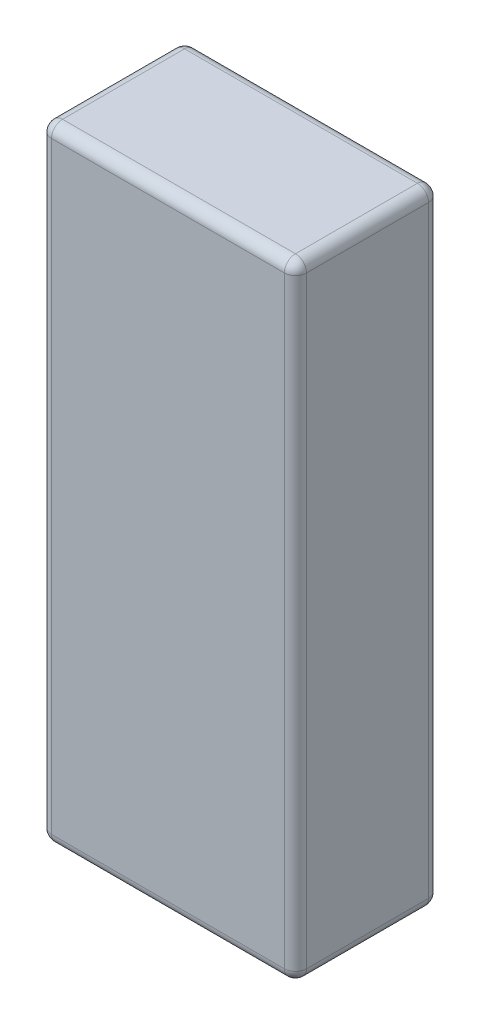
ISO-10303-21;
HEADER;
FILE_DESCRIPTION(('STEP AP214'),'2;1');
FILE_NAME('part.step','',(''),(''),'','','');
FILE_SCHEMA(('AUTOMOTIVE_DESIGN { 1 0 10303 214 1 1 1 1 }'));
ENDSEC;
DATA;
#1=APPLICATION_CONTEXT('core data for automotive mechanical design processes');
#2=APPLICATION_PROTOCOL_DEFINITION('international standard','automotive_design',2000,#1);
#3=PRODUCT_CONTEXT('',#1,'mechanical');
#4=PRODUCT('Part','Part','',(#3));
#5=PRODUCT_RELATED_PRODUCT_CATEGORY('part','',(#4));
#6=PRODUCT_DEFINITION_FORMATION('','',#4);
#7=PRODUCT_DEFINITION_CONTEXT('part definition',#1,'design');
#8=PRODUCT_DEFINITION('design','',#6,#7);
#9=PRODUCT_DEFINITION_SHAPE('','',#8);
#10=(LENGTH_UNIT() NAMED_UNIT(*) SI_UNIT(.MILLI.,.METRE.));
#11=(NAMED_UNIT(*) PLANE_ANGLE_UNIT() SI_UNIT($,.RADIAN.));
#12=(NAMED_UNIT(*) SI_UNIT($,.STERADIAN.) SOLID_ANGLE_UNIT());
#13=UNCERTAINTY_MEASURE_WITH_UNIT(LENGTH_MEASURE(1.E-05),#10,'distance_accuracy_value','');
#14=(GEOMETRIC_REPRESENTATION_CONTEXT(3) GLOBAL_UNCERTAINTY_ASSIGNED_CONTEXT((#13)) GLOBAL_UNIT_ASSIGNED_CONTEXT((#10,
#11,#12)) REPRESENTATION_CONTEXT('',''));
#15=CARTESIAN_POINT('',(0.,0.,0.));
#16=DIRECTION('',(0.,0.,1.));
#17=DIRECTION('',(1.,0.,0.));
#18=AXIS2_PLACEMENT_3D('',#15,#16,#17);
#19=CARTESIAN_POINT('',(34.5,-84.5,19.5));
#20=DIRECTION('',(-1.,0.,0.));
#21=DIRECTION('',(0.,0.,1.));
#22=AXIS2_PLACEMENT_3D('',#19,#20,#21);
#23=PLANE('',#22);
#24=DIRECTION('',(0.,1.,0.));
#25=VECTOR('',#24,1.);
#26=CARTESIAN_POINT('',(34.5,-84.5,16.5));
#27=LINE('',#26,#25);
#28=CARTESIAN_POINT('',(34.5,81.5,16.5));
#29=VERTEX_POINT('',#28);
#30=CARTESIAN_POINT('',(34.5,-81.5,16.5));
#31=VERTEX_POINT('',#30);
#32=EDGE_CURVE('E140',#29,#31,#27,.F.);
#33=ORIENTED_EDGE('',*,*,#32,.T.);
#34=DIRECTION('',(0.,0.,-1.));
#35=VECTOR('',#34,1.);
#36=CARTESIAN_POINT('',(34.5,-81.5,19.5));
#37=LINE('',#36,#35);
#38=CARTESIAN_POINT('',(34.5,-81.5,-16.5));
#39=VERTEX_POINT('',#38);
#40=EDGE_CURVE('E187',#31,#39,#37,.T.);
#41=ORIENTED_EDGE('',*,*,#40,.T.);
#42=DIRECTION('',(0.,1.,0.));
#43=VECTOR('',#42,1.);
#44=CARTESIAN_POINT('',(34.5,84.5,-16.5));
#45=LINE('',#44,#43);
#46=CARTESIAN_POINT('',(34.5,81.5,-16.5));
#47=VERTEX_POINT('',#46);
#48=EDGE_CURVE('E184',#39,#47,#45,.T.);
#49=ORIENTED_EDGE('',*,*,#48,.T.);
#50=DIRECTION('',(0.,0.,-1.));
#51=VECTOR('',#50,1.);
#52=CARTESIAN_POINT('',(34.5,81.5,19.5));
#53=LINE('',#52,#51);
#54=EDGE_CURVE('E182',#47,#29,#53,.F.);
#55=ORIENTED_EDGE('',*,*,#54,.T.);
#56=EDGE_LOOP('',(#33,#41,#49,#55));
#57=FACE_BOUND('',#56,.T.);
#58=ADVANCED_FACE('F33',(#57),#23,.F.);
#59=CARTESIAN_POINT('',(-34.5,84.5,19.5));
#60=DIRECTION('',(0.,-1.,0.));
#61=DIRECTION('',(0.,0.,-1.));
#62=AXIS2_PLACEMENT_3D('',#59,#60,#61);
#63=PLANE('',#62);
#64=DIRECTION('',(-1.,0.,0.));
#65=VECTOR('',#64,1.);
#66=CARTESIAN_POINT('',(-34.5,84.5,16.5));
#67=LINE('',#66,#65);
#68=CARTESIAN_POINT('',(-31.5,84.5,16.5));
#69=VERTEX_POINT('',#68);
#70=CARTESIAN_POINT('',(31.5,84.5,16.5));
#71=VERTEX_POINT('',#70);
#72=EDGE_CURVE('E42',#69,#71,#67,.F.);
#73=ORIENTED_EDGE('',*,*,#72,.T.);
#74=DIRECTION('',(0.,0.,-1.));
#75=VECTOR('',#74,1.);
#76=CARTESIAN_POINT('',(31.5,84.5,19.5));
#77=LINE('',#76,#75);
#78=CARTESIAN_POINT('',(31.5,84.5,-16.5));
#79=VERTEX_POINT('',#78);
#80=EDGE_CURVE('E11',#71,#79,#77,.T.);
#81=ORIENTED_EDGE('',*,*,#80,.T.);
#82=DIRECTION('',(-1.,0.,0.));
#83=VECTOR('',#82,1.);
#84=CARTESIAN_POINT('',(-34.5,84.5,-16.5));
#85=LINE('',#84,#83);
#86=CARTESIAN_POINT('',(-31.5,84.5,-16.5));
#87=VERTEX_POINT('',#86);
#88=EDGE_CURVE('E198',#79,#87,#85,.T.);
#89=ORIENTED_EDGE('',*,*,#88,.T.);
#90=DIRECTION('',(0.,0.,-1.));
#91=VECTOR('',#90,1.);
#92=CARTESIAN_POINT('',(-31.5,84.5,19.5));
#93=LINE('',#92,#91);
#94=EDGE_CURVE('E53',#87,#69,#93,.F.);
#95=ORIENTED_EDGE('',*,*,#94,.T.);
#96=EDGE_LOOP('',(#73,#81,#89,#95));
#97=FACE_BOUND('',#96,.T.);
#98=ADVANCED_FACE('F297',(#97),#63,.F.);
#99=CARTESIAN_POINT('',(-34.5,-84.5,19.5));
#100=DIRECTION('',(1.,0.,0.));
#101=DIRECTION('',(0.,0.,-1.));
#102=AXIS2_PLACEMENT_3D('',#99,#100,#101);
#103=PLANE('',#102);
#104=DIRECTION('',(0.,-1.,0.));
#105=VECTOR('',#104,1.);
#106=CARTESIAN_POINT('',(-34.5,-84.5,-16.5));
#107=LINE('',#106,#105);
#108=CARTESIAN_POINT('',(-34.5,81.5,-16.5));
#109=VERTEX_POINT('',#108);
#110=CARTESIAN_POINT('',(-34.5,-81.5,-16.5));
#111=VERTEX_POINT('',#110);
#112=EDGE_CURVE('E166',#109,#111,#107,.T.);
#113=ORIENTED_EDGE('',*,*,#112,.T.);
#114=DIRECTION('',(0.,0.,-1.));
#115=VECTOR('',#114,1.);
#116=CARTESIAN_POINT('',(-34.5,-81.5,19.5));
#117=LINE('',#116,#115);
#118=CARTESIAN_POINT('',(-34.5,-81.5,16.5));
#119=VERTEX_POINT('',#118);
#120=EDGE_CURVE('E171',#111,#119,#117,.F.);
#121=ORIENTED_EDGE('',*,*,#120,.T.);
#122=DIRECTION('',(0.,-1.,0.));
#123=VECTOR('',#122,1.);
#124=CARTESIAN_POINT('',(-34.5,-84.5,16.5));
#125=LINE('',#124,#123);
#126=CARTESIAN_POINT('',(-34.5,81.5,16.5));
#127=VERTEX_POINT('',#126);
#128=EDGE_CURVE('E168',#119,#127,#125,.F.);
#129=ORIENTED_EDGE('',*,*,#128,.T.);
#130=DIRECTION('',(0.,0.,-1.));
#131=VECTOR('',#130,1.);
#132=CARTESIAN_POINT('',(-34.5,81.5,19.5));
#133=LINE('',#132,#131);
#134=EDGE_CURVE('E164',#127,#109,#133,.T.);
#135=ORIENTED_EDGE('',*,*,#134,.T.);
#136=EDGE_LOOP('',(#113,#121,#129,#135));
#137=FACE_BOUND('',#136,.T.);
#138=ADVANCED_FACE('F302',(#137),#103,.F.);
#139=CARTESIAN_POINT('',(-34.5,-84.5,19.5));
#140=DIRECTION('',(0.,1.,0.));
#141=DIRECTION('',(0.,0.,1.));
#142=AXIS2_PLACEMENT_3D('',#139,#140,#141);
#143=PLANE('',#142);
#144=DIRECTION('',(1.,0.,0.));
#145=VECTOR('',#144,1.);
#146=CARTESIAN_POINT('',(-34.5,-84.5,16.5));
#147=LINE('',#146,#145);
#148=CARTESIAN_POINT('',(31.5,-84.5,16.5));
#149=VERTEX_POINT('',#148);
#150=CARTESIAN_POINT('',(-31.5,-84.5,16.5));
#151=VERTEX_POINT('',#150);
#152=EDGE_CURVE('E193',#149,#151,#147,.F.);
#153=ORIENTED_EDGE('',*,*,#152,.T.);
#154=DIRECTION('',(0.,0.,-1.));
#155=VECTOR('',#154,1.);
#156=CARTESIAN_POINT('',(-31.5,-84.5,19.5));
#157=LINE('',#156,#155);
#158=CARTESIAN_POINT('',(-31.5,-84.5,-16.5));
#159=VERTEX_POINT('',#158);
#160=EDGE_CURVE('E195',#151,#159,#157,.T.);
#161=ORIENTED_EDGE('',*,*,#160,.T.);
#162=DIRECTION('',(1.,0.,0.));
#163=VECTOR('',#162,1.);
#164=CARTESIAN_POINT('',(34.5,-84.5,-16.5));
#165=LINE('',#164,#163);
#166=CARTESIAN_POINT('',(31.5,-84.5,-16.5));
#167=VERTEX_POINT('',#166);
#168=EDGE_CURVE('E189',#159,#167,#165,.T.);
#169=ORIENTED_EDGE('',*,*,#168,.T.);
#170=DIRECTION('',(0.,0.,-1.));
#171=VECTOR('',#170,1.);
#172=CARTESIAN_POINT('',(31.5,-84.5,19.5));
#173=LINE('',#172,#171);
#174=EDGE_CURVE('E191',#167,#149,#173,.F.);
#175=ORIENTED_EDGE('',*,*,#174,.T.);
#176=EDGE_LOOP('',(#153,#161,#169,#175));
#177=FACE_BOUND('',#176,.T.);
#178=ADVANCED_FACE('F265',(#177),#143,.F.);
#179=CARTESIAN_POINT('',(0.,0.,19.5));
#180=DIRECTION('',(0.,0.,-1.));
#181=DIRECTION('',(-1.,0.,0.));
#182=AXIS2_PLACEMENT_3D('',#179,#180,#181);
#183=PLANE('',#182);
#184=DIRECTION('',(0.,-1.,0.));
#185=VECTOR('',#184,1.);
#186=CARTESIAN_POINT('',(-31.5,0.,19.5));
#187=LINE('',#186,#185);
#188=CARTESIAN_POINT('',(-31.5,81.5,19.5));
#189=VERTEX_POINT('',#188);
#190=CARTESIAN_POINT('',(-31.5,-81.5,19.5));
#191=VERTEX_POINT('',#190);
#192=EDGE_CURVE('E132',#189,#191,#187,.T.);
#193=ORIENTED_EDGE('',*,*,#192,.T.);
#194=DIRECTION('',(1.,0.,0.));
#195=VECTOR('',#194,1.);
#196=CARTESIAN_POINT('',(0.,-81.5,19.5));
#197=LINE('',#196,#195);
#198=CARTESIAN_POINT('',(31.5,-81.5,19.5));
#199=VERTEX_POINT('',#198);
#200=EDGE_CURVE('E128',#191,#199,#197,.T.);
#201=ORIENTED_EDGE('',*,*,#200,.T.);
#202=DIRECTION('',(0.,1.,0.));
#203=VECTOR('',#202,1.);
#204=CARTESIAN_POINT('',(31.5,0.,19.5));
#205=LINE('',#204,#203);
#206=CARTESIAN_POINT('',(31.5,81.5,19.5));
#207=VERTEX_POINT('',#206);
#208=EDGE_CURVE('E120',#199,#207,#205,.T.);
#209=ORIENTED_EDGE('',*,*,#208,.T.);
#210=DIRECTION('',(-1.,0.,0.));
#211=VECTOR('',#210,1.);
#212=CARTESIAN_POINT('',(0.,81.5,19.5));
#213=LINE('',#212,#211);
#214=EDGE_CURVE('E125',#207,#189,#213,.T.);
#215=ORIENTED_EDGE('',*,*,#214,.T.);
#216=EDGE_LOOP('',(#193,#201,#209,#215));
#217=FACE_BOUND('',#216,.T.);
#218=ADVANCED_FACE('F123',(#217),#183,.F.);
#219=CARTESIAN_POINT('',(0.,0.,-19.5));
#220=DIRECTION('',(0.,0.,-1.));
#221=DIRECTION('',(-1.,0.,0.));
#222=AXIS2_PLACEMENT_3D('',#219,#220,#221);
#223=PLANE('',#222);
#224=DIRECTION('',(0.,1.,0.));
#225=VECTOR('',#224,1.);
#226=CARTESIAN_POINT('',(31.5,-84.5,-19.5));
#227=LINE('',#226,#225);
#228=CARTESIAN_POINT('',(31.5,81.5,-19.5));
#229=VERTEX_POINT('',#228);
#230=CARTESIAN_POINT('',(31.5,-81.5,-19.5));
#231=VERTEX_POINT('',#230);
#232=EDGE_CURVE('E175',#229,#231,#227,.F.);
#233=ORIENTED_EDGE('',*,*,#232,.T.);
#234=DIRECTION('',(1.,0.,0.));
#235=VECTOR('',#234,1.);
#236=CARTESIAN_POINT('',(-34.5,-81.5,-19.5));
#237=LINE('',#236,#235);
#238=CARTESIAN_POINT('',(-31.5,-81.5,-19.5));
#239=VERTEX_POINT('',#238);
#240=EDGE_CURVE('E180',#231,#239,#237,.F.);
#241=ORIENTED_EDGE('',*,*,#240,.T.);
#242=DIRECTION('',(0.,-1.,0.));
#243=VECTOR('',#242,1.);
#244=CARTESIAN_POINT('',(-31.5,84.5,-19.5));
#245=LINE('',#244,#243);
#246=CARTESIAN_POINT('',(-31.5,81.5,-19.5));
#247=VERTEX_POINT('',#246);
#248=EDGE_CURVE('E177',#239,#247,#245,.F.);
#249=ORIENTED_EDGE('',*,*,#248,.T.);
#250=DIRECTION('',(-1.,0.,0.));
#251=VECTOR('',#250,1.);
#252=CARTESIAN_POINT('',(34.5,81.5,-19.5));
#253=LINE('',#252,#251);
#254=EDGE_CURVE('E173',#247,#229,#253,.F.);
#255=ORIENTED_EDGE('',*,*,#254,.T.);
#256=EDGE_LOOP('',(#233,#241,#249,#255));
#257=FACE_BOUND('',#256,.T.);
#258=ADVANCED_FACE('F274',(#257),#223,.T.);
#259=CARTESIAN_POINT('',(31.5,-84.5,-16.5));
#260=DIRECTION('',(0.,-1.,0.));
#261=DIRECTION('',(0.,0.,-1.));
#262=AXIS2_PLACEMENT_3D('',#259,#260,#261);
#263=CYLINDRICAL_SURFACE('',#262,3.);
#264=CARTESIAN_POINT('',(31.5,81.5,-16.5));
#265=DIRECTION('',(0.,1.,0.));
#266=DIRECTION('',(0.,0.,1.));
#267=AXIS2_PLACEMENT_3D('',#264,#265,#266);
#268=CIRCLE('',#267,3.);
#269=EDGE_CURVE('E37',#47,#229,#268,.T.);
#270=ORIENTED_EDGE('',*,*,#269,.F.);
#271=ORIENTED_EDGE('',*,*,#48,.F.);
#272=CARTESIAN_POINT('',(31.5,-81.5,-16.5));
#273=DIRECTION('',(0.,-1.,0.));
#274=DIRECTION('',(0.,0.,-1.));
#275=AXIS2_PLACEMENT_3D('',#272,#273,#274);
#276=CIRCLE('',#275,3.);
#277=EDGE_CURVE('E160',#231,#39,#276,.T.);
#278=ORIENTED_EDGE('',*,*,#277,.F.);
#279=ORIENTED_EDGE('',*,*,#232,.F.);
#280=EDGE_LOOP('',(#270,#271,#278,#279));
#281=FACE_BOUND('',#280,.T.);
#282=ADVANCED_FACE('F35',(#281),#263,.T.);
#283=CARTESIAN_POINT('',(31.5,81.5,-16.5));
#284=DIRECTION('',(0.,0.,1.));
#285=DIRECTION('',(1.,0.,0.));
#286=AXIS2_PLACEMENT_3D('',#283,#284,#285);
#287=SPHERICAL_SURFACE('',#286,3.);
#288=CARTESIAN_POINT('',(31.5,81.5,-16.5));
#289=DIRECTION('',(0.,0.,-1.));
#290=DIRECTION('',(-1.,0.,0.));
#291=AXIS2_PLACEMENT_3D('',#288,#289,#290);
#292=CIRCLE('',#291,3.);
#293=EDGE_CURVE('E243',#47,#79,#292,.F.);
#294=ORIENTED_EDGE('',*,*,#293,.F.);
#295=ORIENTED_EDGE('',*,*,#269,.T.);
#296=CARTESIAN_POINT('',(31.5,81.5,-16.5));
#297=DIRECTION('',(1.,0.,0.));
#298=DIRECTION('',(0.,0.,-1.));
#299=AXIS2_PLACEMENT_3D('',#296,#297,#298);
#300=CIRCLE('',#299,3.);
#301=EDGE_CURVE('E246',#79,#229,#300,.F.);
#302=ORIENTED_EDGE('',*,*,#301,.F.);
#303=EDGE_LOOP('',(#294,#295,#302));
#304=FACE_BOUND('',#303,.T.);
#305=ADVANCED_FACE('F291',(#304),#287,.T.);
#306=CARTESIAN_POINT('',(31.5,-81.5,-16.5));
#307=DIRECTION('',(0.,0.,1.));
#308=DIRECTION('',(1.,0.,0.));
#309=AXIS2_PLACEMENT_3D('',#306,#307,#308);
#310=SPHERICAL_SURFACE('',#309,3.);
#311=CARTESIAN_POINT('',(31.5,-81.5,-16.5));
#312=DIRECTION('',(1.,0.,0.));
#313=DIRECTION('',(0.,0.,-1.));
#314=AXIS2_PLACEMENT_3D('',#311,#312,#313);
#315=CIRCLE('',#314,3.);
#316=EDGE_CURVE('E237',#231,#167,#315,.F.);
#317=ORIENTED_EDGE('',*,*,#316,.F.);
#318=ORIENTED_EDGE('',*,*,#277,.T.);
#319=CARTESIAN_POINT('',(31.5,-81.5,-16.5));
#320=DIRECTION('',(0.,0.,-1.));
#321=DIRECTION('',(-1.,0.,0.));
#322=AXIS2_PLACEMENT_3D('',#319,#320,#321);
#323=CIRCLE('',#322,3.);
#324=EDGE_CURVE('E240',#167,#39,#323,.F.);
#325=ORIENTED_EDGE('',*,*,#324,.F.);
#326=EDGE_LOOP('',(#317,#318,#325));
#327=FACE_BOUND('',#326,.T.);
#328=ADVANCED_FACE('F253',(#327),#310,.T.);
#329=CARTESIAN_POINT('',(-34.5,81.5,-16.5));
#330=DIRECTION('',(1.,0.,0.));
#331=DIRECTION('',(0.,0.,-1.));
#332=AXIS2_PLACEMENT_3D('',#329,#330,#331);
#333=CYLINDRICAL_SURFACE('',#332,3.);
#334=ORIENTED_EDGE('',*,*,#301,.T.);
#335=ORIENTED_EDGE('',*,*,#254,.F.);
#336=CARTESIAN_POINT('',(-31.5,81.5,-16.5));
#337=DIRECTION('',(-1.,0.,0.));
#338=DIRECTION('',(0.,0.,1.));
#339=AXIS2_PLACEMENT_3D('',#336,#337,#338);
#340=CIRCLE('',#339,3.);
#341=EDGE_CURVE('E232',#87,#247,#340,.T.);
#342=ORIENTED_EDGE('',*,*,#341,.F.);
#343=ORIENTED_EDGE('',*,*,#88,.F.);
#344=EDGE_LOOP('',(#334,#335,#342,#343));
#345=FACE_BOUND('',#344,.T.);
#346=ADVANCED_FACE('F286',(#345),#333,.T.);
#347=CARTESIAN_POINT('',(31.5,81.5,19.5));
#348=DIRECTION('',(0.,0.,-1.));
#349=DIRECTION('',(-1.,0.,0.));
#350=AXIS2_PLACEMENT_3D('',#347,#348,#349);
#351=CYLINDRICAL_SURFACE('',#350,3.);
#352=ORIENTED_EDGE('',*,*,#293,.T.);
#353=ORIENTED_EDGE('',*,*,#80,.F.);
#354=CARTESIAN_POINT('',(31.5,81.5,16.5));
#355=DIRECTION('',(0.,0.,1.));
#356=DIRECTION('',(1.,0.,0.));
#357=AXIS2_PLACEMENT_3D('',#354,#355,#356);
#358=CIRCLE('',#357,3.);
#359=EDGE_CURVE('E144',#29,#71,#358,.T.);
#360=ORIENTED_EDGE('',*,*,#359,.F.);
#361=ORIENTED_EDGE('',*,*,#54,.F.);
#362=EDGE_LOOP('',(#352,#353,#360,#361));
#363=FACE_BOUND('',#362,.T.);
#364=ADVANCED_FACE('F294',(#363),#351,.T.);
#365=CARTESIAN_POINT('',(31.5,0.,16.5));
#366=DIRECTION('',(0.,1.,0.));
#367=DIRECTION('',(0.,0.,1.));
#368=AXIS2_PLACEMENT_3D('',#365,#366,#367);
#369=CYLINDRICAL_SURFACE('',#368,3.);
#370=CARTESIAN_POINT('',(31.5,-81.5,16.5));
#371=DIRECTION('',(0.,-1.,0.));
#372=DIRECTION('',(0.,0.,-1.));
#373=AXIS2_PLACEMENT_3D('',#370,#371,#372);
#374=CIRCLE('',#373,3.);
#375=EDGE_CURVE('E145',#31,#199,#374,.T.);
#376=ORIENTED_EDGE('',*,*,#375,.F.);
#377=ORIENTED_EDGE('',*,*,#32,.F.);
#378=CARTESIAN_POINT('',(31.5,81.5,16.5));
#379=DIRECTION('',(0.,1.,0.));
#380=DIRECTION('',(0.,0.,1.));
#381=AXIS2_PLACEMENT_3D('',#378,#379,#380);
#382=CIRCLE('',#381,3.);
#383=EDGE_CURVE('E136',#207,#29,#382,.T.);
#384=ORIENTED_EDGE('',*,*,#383,.F.);
#385=ORIENTED_EDGE('',*,*,#208,.F.);
#386=EDGE_LOOP('',(#376,#377,#384,#385));
#387=FACE_BOUND('',#386,.T.);
#388=ADVANCED_FACE('F138',(#387),#369,.T.);
#389=CARTESIAN_POINT('',(31.5,-81.5,19.5));
#390=DIRECTION('',(0.,0.,-1.));
#391=DIRECTION('',(-1.,0.,0.));
#392=AXIS2_PLACEMENT_3D('',#389,#390,#391);
#393=CYLINDRICAL_SURFACE('',#392,3.);
#394=ORIENTED_EDGE('',*,*,#324,.T.);
#395=ORIENTED_EDGE('',*,*,#40,.F.);
#396=CARTESIAN_POINT('',(31.5,-81.5,16.5));
#397=DIRECTION('',(0.,0.,1.));
#398=DIRECTION('',(1.,0.,0.));
#399=AXIS2_PLACEMENT_3D('',#396,#397,#398);
#400=CIRCLE('',#399,3.);
#401=EDGE_CURVE('E228',#149,#31,#400,.T.);
#402=ORIENTED_EDGE('',*,*,#401,.F.);
#403=ORIENTED_EDGE('',*,*,#174,.F.);
#404=EDGE_LOOP('',(#394,#395,#402,#403));
#405=FACE_BOUND('',#404,.T.);
#406=ADVANCED_FACE('F261',(#405),#393,.T.);
#407=CARTESIAN_POINT('',(-34.5,-81.5,-16.5));
#408=DIRECTION('',(-1.,0.,0.));
#409=DIRECTION('',(0.,0.,1.));
#410=AXIS2_PLACEMENT_3D('',#407,#408,#409);
#411=CYLINDRICAL_SURFACE('',#410,3.);
#412=ORIENTED_EDGE('',*,*,#316,.T.);
#413=ORIENTED_EDGE('',*,*,#168,.F.);
#414=CARTESIAN_POINT('',(-31.5,-81.5,-16.5));
#415=DIRECTION('',(-1.,0.,0.));
#416=DIRECTION('',(0.,0.,1.));
#417=AXIS2_PLACEMENT_3D('',#414,#415,#416);
#418=CIRCLE('',#417,3.);
#419=EDGE_CURVE('E225',#239,#159,#418,.T.);
#420=ORIENTED_EDGE('',*,*,#419,.F.);
#421=ORIENTED_EDGE('',*,*,#240,.F.);
#422=EDGE_LOOP('',(#412,#413,#420,#421));
#423=FACE_BOUND('',#422,.T.);
#424=ADVANCED_FACE('F271',(#423),#411,.T.);
#425=CARTESIAN_POINT('',(-31.5,-84.5,-16.5));
#426=DIRECTION('',(0.,1.,0.));
#427=DIRECTION('',(0.,0.,1.));
#428=AXIS2_PLACEMENT_3D('',#425,#426,#427);
#429=CYLINDRICAL_SURFACE('',#428,3.);
#430=CARTESIAN_POINT('',(-31.5,81.5,-16.5));
#431=DIRECTION('',(0.,1.,0.));
#432=DIRECTION('',(0.,0.,1.));
#433=AXIS2_PLACEMENT_3D('',#430,#431,#432);
#434=CIRCLE('',#433,3.);
#435=EDGE_CURVE('E234',#247,#109,#434,.T.);
#436=ORIENTED_EDGE('',*,*,#435,.F.);
#437=ORIENTED_EDGE('',*,*,#248,.F.);
#438=CARTESIAN_POINT('',(-31.5,-81.5,-16.5));
#439=DIRECTION('',(0.,-1.,0.));
#440=DIRECTION('',(0.,0.,-1.));
#441=AXIS2_PLACEMENT_3D('',#438,#439,#440);
#442=CIRCLE('',#441,3.);
#443=EDGE_CURVE('E222',#111,#239,#442,.T.);
#444=ORIENTED_EDGE('',*,*,#443,.F.);
#445=ORIENTED_EDGE('',*,*,#112,.F.);
#446=EDGE_LOOP('',(#436,#437,#444,#445));
#447=FACE_BOUND('',#446,.T.);
#448=ADVANCED_FACE('F278',(#447),#429,.T.);
#449=CARTESIAN_POINT('',(-31.5,81.5,-16.5));
#450=DIRECTION('',(0.,0.,1.));
#451=DIRECTION('',(1.,0.,0.));
#452=AXIS2_PLACEMENT_3D('',#449,#450,#451);
#453=SPHERICAL_SURFACE('',#452,3.);
#454=ORIENTED_EDGE('',*,*,#341,.T.);
#455=ORIENTED_EDGE('',*,*,#435,.T.);
#456=CARTESIAN_POINT('',(-31.5,81.5,-16.5));
#457=DIRECTION('',(0.,0.,-1.));
#458=DIRECTION('',(-1.,0.,0.));
#459=AXIS2_PLACEMENT_3D('',#456,#457,#458);
#460=CIRCLE('',#459,3.);
#461=EDGE_CURVE('E151',#87,#109,#460,.F.);
#462=ORIENTED_EDGE('',*,*,#461,.F.);
#463=EDGE_LOOP('',(#454,#455,#462));
#464=FACE_BOUND('',#463,.T.);
#465=ADVANCED_FACE('F342',(#464),#453,.T.);
#466=CARTESIAN_POINT('',(31.5,81.5,16.5));
#467=DIRECTION('',(0.,0.,1.));
#468=DIRECTION('',(1.,0.,0.));
#469=AXIS2_PLACEMENT_3D('',#466,#467,#468);
#470=SPHERICAL_SURFACE('',#469,3.);
#471=ORIENTED_EDGE('',*,*,#383,.T.);
#472=ORIENTED_EDGE('',*,*,#359,.T.);
#473=CARTESIAN_POINT('',(31.5,81.5,16.5));
#474=DIRECTION('',(1.,0.,0.));
#475=DIRECTION('',(0.,0.,-1.));
#476=AXIS2_PLACEMENT_3D('',#473,#474,#475);
#477=CIRCLE('',#476,3.);
#478=EDGE_CURVE('E148',#207,#71,#477,.F.);
#479=ORIENTED_EDGE('',*,*,#478,.F.);
#480=EDGE_LOOP('',(#471,#472,#479));
#481=FACE_BOUND('',#480,.T.);
#482=ADVANCED_FACE('F149',(#481),#470,.T.);
#483=CARTESIAN_POINT('',(31.5,-81.5,16.5));
#484=DIRECTION('',(0.,0.,1.));
#485=DIRECTION('',(1.,0.,0.));
#486=AXIS2_PLACEMENT_3D('',#483,#484,#485);
#487=SPHERICAL_SURFACE('',#486,3.);
#488=ORIENTED_EDGE('',*,*,#401,.T.);
#489=ORIENTED_EDGE('',*,*,#375,.T.);
#490=CARTESIAN_POINT('',(31.5,-81.5,16.5));
#491=DIRECTION('',(1.,0.,0.));
#492=DIRECTION('',(0.,0.,-1.));
#493=AXIS2_PLACEMENT_3D('',#490,#491,#492);
#494=CIRCLE('',#493,3.);
#495=EDGE_CURVE('E152',#149,#199,#494,.F.);
#496=ORIENTED_EDGE('',*,*,#495,.F.);
#497=EDGE_LOOP('',(#488,#489,#496));
#498=FACE_BOUND('',#497,.T.);
#499=ADVANCED_FACE('F335',(#498),#487,.T.);
#500=CARTESIAN_POINT('',(-31.5,-81.5,-16.5));
#501=DIRECTION('',(0.,0.,1.));
#502=DIRECTION('',(1.,0.,0.));
#503=AXIS2_PLACEMENT_3D('',#500,#501,#502);
#504=SPHERICAL_SURFACE('',#503,3.);
#505=ORIENTED_EDGE('',*,*,#443,.T.);
#506=ORIENTED_EDGE('',*,*,#419,.T.);
#507=CARTESIAN_POINT('',(-31.5,-81.5,-16.5));
#508=DIRECTION('',(0.,0.,-1.));
#509=DIRECTION('',(-1.,0.,0.));
#510=AXIS2_PLACEMENT_3D('',#507,#508,#509);
#511=CIRCLE('',#510,3.);
#512=EDGE_CURVE('E216',#111,#159,#511,.F.);
#513=ORIENTED_EDGE('',*,*,#512,.F.);
#514=EDGE_LOOP('',(#505,#506,#513));
#515=FACE_BOUND('',#514,.T.);
#516=ADVANCED_FACE('F331',(#515),#504,.T.);
#517=CARTESIAN_POINT('',(-31.5,81.5,19.5));
#518=DIRECTION('',(0.,0.,-1.));
#519=DIRECTION('',(-1.,0.,0.));
#520=AXIS2_PLACEMENT_3D('',#517,#518,#519);
#521=CYLINDRICAL_SURFACE('',#520,3.);
#522=ORIENTED_EDGE('',*,*,#461,.T.);
#523=ORIENTED_EDGE('',*,*,#134,.F.);
#524=CARTESIAN_POINT('',(-31.5,81.5,16.5));
#525=DIRECTION('',(0.,0.,1.));
#526=DIRECTION('',(1.,0.,0.));
#527=AXIS2_PLACEMENT_3D('',#524,#525,#526);
#528=CIRCLE('',#527,3.);
#529=EDGE_CURVE('E213',#69,#127,#528,.T.);
#530=ORIENTED_EDGE('',*,*,#529,.F.);
#531=ORIENTED_EDGE('',*,*,#94,.F.);
#532=EDGE_LOOP('',(#522,#523,#530,#531));
#533=FACE_BOUND('',#532,.T.);
#534=ADVANCED_FACE('F328',(#533),#521,.T.);
#535=CARTESIAN_POINT('',(0.,81.5,16.5));
#536=DIRECTION('',(-1.,0.,0.));
#537=DIRECTION('',(0.,0.,1.));
#538=AXIS2_PLACEMENT_3D('',#535,#536,#537);
#539=CYLINDRICAL_SURFACE('',#538,3.);
#540=ORIENTED_EDGE('',*,*,#478,.T.);
#541=ORIENTED_EDGE('',*,*,#72,.F.);
#542=CARTESIAN_POINT('',(-31.5,81.5,16.5));
#543=DIRECTION('',(-1.,0.,0.));
#544=DIRECTION('',(0.,0.,1.));
#545=AXIS2_PLACEMENT_3D('',#542,#543,#544);
#546=CIRCLE('',#545,3.);
#547=EDGE_CURVE('E156',#189,#69,#546,.T.);
#548=ORIENTED_EDGE('',*,*,#547,.F.);
#549=ORIENTED_EDGE('',*,*,#214,.F.);
#550=EDGE_LOOP('',(#540,#541,#548,#549));
#551=FACE_BOUND('',#550,.T.);
#552=ADVANCED_FACE('F154',(#551),#539,.T.);
#553=CARTESIAN_POINT('',(0.,-81.5,16.5));
#554=DIRECTION('',(1.,0.,0.));
#555=DIRECTION('',(0.,0.,-1.));
#556=AXIS2_PLACEMENT_3D('',#553,#554,#555);
#557=CYLINDRICAL_SURFACE('',#556,3.);
#558=ORIENTED_EDGE('',*,*,#495,.T.);
#559=ORIENTED_EDGE('',*,*,#200,.F.);
#560=CARTESIAN_POINT('',(-31.5,-81.5,16.5));
#561=DIRECTION('',(-1.,0.,0.));
#562=DIRECTION('',(0.,0.,1.));
#563=AXIS2_PLACEMENT_3D('',#560,#561,#562);
#564=CIRCLE('',#563,3.);
#565=EDGE_CURVE('E209',#151,#191,#564,.T.);
#566=ORIENTED_EDGE('',*,*,#565,.F.);
#567=ORIENTED_EDGE('',*,*,#152,.F.);
#568=EDGE_LOOP('',(#558,#559,#566,#567));
#569=FACE_BOUND('',#568,.T.);
#570=ADVANCED_FACE('F321',(#569),#557,.T.);
#571=CARTESIAN_POINT('',(-31.5,-81.5,19.5));
#572=DIRECTION('',(0.,0.,-1.));
#573=DIRECTION('',(-1.,0.,0.));
#574=AXIS2_PLACEMENT_3D('',#571,#572,#573);
#575=CYLINDRICAL_SURFACE('',#574,3.);
#576=ORIENTED_EDGE('',*,*,#512,.T.);
#577=ORIENTED_EDGE('',*,*,#160,.F.);
#578=CARTESIAN_POINT('',(-31.5,-81.5,16.5));
#579=DIRECTION('',(0.,0.,1.));
#580=DIRECTION('',(1.,0.,0.));
#581=AXIS2_PLACEMENT_3D('',#578,#579,#580);
#582=CIRCLE('',#581,3.);
#583=EDGE_CURVE('E206',#119,#151,#582,.T.);
#584=ORIENTED_EDGE('',*,*,#583,.F.);
#585=ORIENTED_EDGE('',*,*,#120,.F.);
#586=EDGE_LOOP('',(#576,#577,#584,#585));
#587=FACE_BOUND('',#586,.T.);
#588=ADVANCED_FACE('F317',(#587),#575,.T.);
#589=CARTESIAN_POINT('',(-31.5,81.5,16.5));
#590=DIRECTION('',(0.,0.,1.));
#591=DIRECTION('',(1.,0.,0.));
#592=AXIS2_PLACEMENT_3D('',#589,#590,#591);
#593=SPHERICAL_SURFACE('',#592,3.);
#594=ORIENTED_EDGE('',*,*,#547,.T.);
#595=ORIENTED_EDGE('',*,*,#529,.T.);
#596=CARTESIAN_POINT('',(-31.5,81.5,16.5));
#597=DIRECTION('',(0.,1.,0.));
#598=DIRECTION('',(0.,0.,1.));
#599=AXIS2_PLACEMENT_3D('',#596,#597,#598);
#600=CIRCLE('',#599,3.);
#601=EDGE_CURVE('E204',#189,#127,#600,.F.);
#602=ORIENTED_EDGE('',*,*,#601,.F.);
#603=EDGE_LOOP('',(#594,#595,#602));
#604=FACE_BOUND('',#603,.T.);
#605=ADVANCED_FACE('F313',(#604),#593,.T.);
#606=CARTESIAN_POINT('',(-31.5,-81.5,16.5));
#607=DIRECTION('',(0.,0.,1.));
#608=DIRECTION('',(1.,0.,0.));
#609=AXIS2_PLACEMENT_3D('',#606,#607,#608);
#610=SPHERICAL_SURFACE('',#609,3.);
#611=ORIENTED_EDGE('',*,*,#583,.T.);
#612=ORIENTED_EDGE('',*,*,#565,.T.);
#613=CARTESIAN_POINT('',(-31.5,-81.5,16.5));
#614=DIRECTION('',(0.,-1.,0.));
#615=DIRECTION('',(0.,0.,-1.));
#616=AXIS2_PLACEMENT_3D('',#613,#614,#615);
#617=CIRCLE('',#616,3.);
#618=EDGE_CURVE('E202',#119,#191,#617,.F.);
#619=ORIENTED_EDGE('',*,*,#618,.F.);
#620=EDGE_LOOP('',(#611,#612,#619));
#621=FACE_BOUND('',#620,.T.);
#622=ADVANCED_FACE('F309',(#621),#610,.T.);
#623=CARTESIAN_POINT('',(-31.5,0.,16.5));
#624=DIRECTION('',(0.,-1.,0.));
#625=DIRECTION('',(0.,0.,-1.));
#626=AXIS2_PLACEMENT_3D('',#623,#624,#625);
#627=CYLINDRICAL_SURFACE('',#626,3.);
#628=ORIENTED_EDGE('',*,*,#601,.T.);
#629=ORIENTED_EDGE('',*,*,#128,.F.);
#630=ORIENTED_EDGE('',*,*,#618,.T.);
#631=ORIENTED_EDGE('',*,*,#192,.F.);
#632=EDGE_LOOP('',(#628,#629,#630,#631));
#633=FACE_BOUND('',#632,.T.);
#634=ADVANCED_FACE('F306',(#633),#627,.T.);
#635=CLOSED_SHELL('',(#58,#98,#138,#178,#218,#258,#282,#305,#328,#346,#364,#388,#406,#424,#448,
#465,#482,#499,#516,#534,#552,#570,#588,#605,#622,#634));
#636=MANIFOLD_SOLID_BREP('B2',#635);
#637=ADVANCED_BREP_SHAPE_REPRESENTATION('',(#18,#636),#14);
#638=SHAPE_DEFINITION_REPRESENTATION(#9,#637);
ENDSEC;
END-ISO-10303-21;
